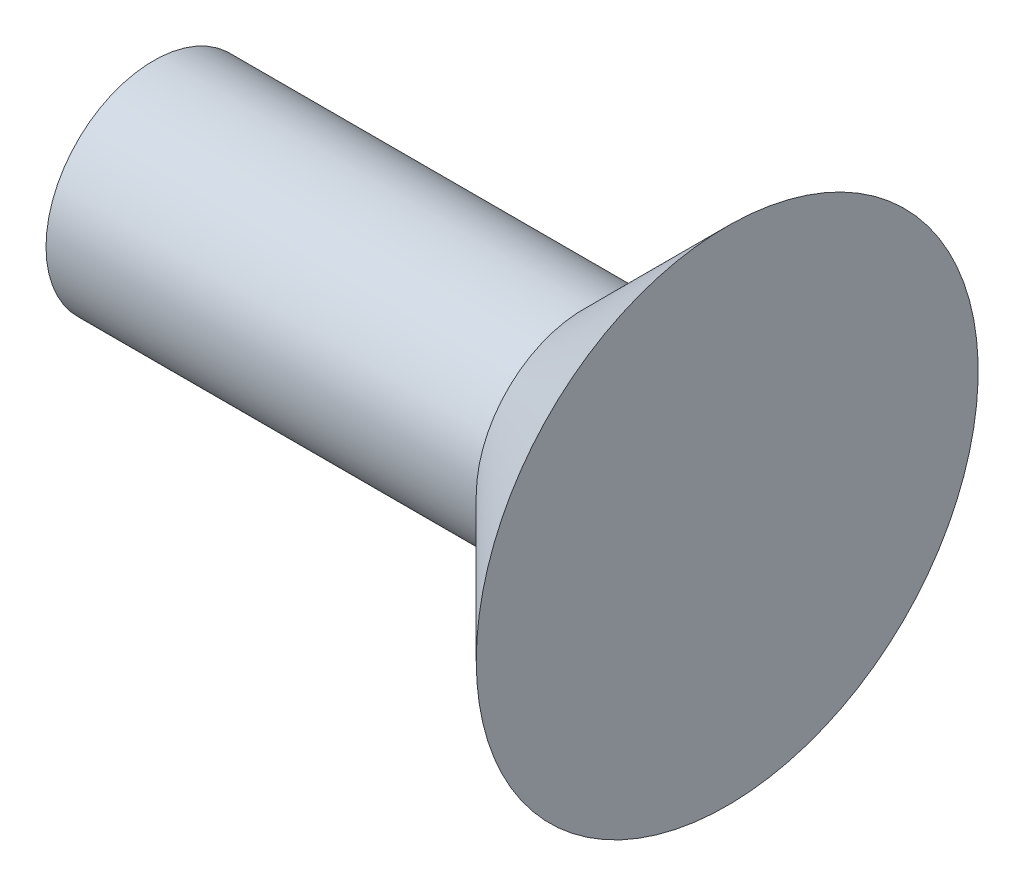
ISO-10303-21;
HEADER;
FILE_DESCRIPTION(('STEP AP214'),'2;1');
FILE_NAME('part.step','',(''),(''),'','','');
FILE_SCHEMA(('AUTOMOTIVE_DESIGN { 1 0 10303 214 1 1 1 1 }'));
ENDSEC;
DATA;
#1=APPLICATION_CONTEXT('core data for automotive mechanical design processes');
#2=APPLICATION_PROTOCOL_DEFINITION('international standard','automotive_design',2000,#1);
#3=PRODUCT_CONTEXT('',#1,'mechanical');
#4=PRODUCT('Part','Part','',(#3));
#5=PRODUCT_RELATED_PRODUCT_CATEGORY('part','',(#4));
#6=PRODUCT_DEFINITION_FORMATION('','',#4);
#7=PRODUCT_DEFINITION_CONTEXT('part definition',#1,'design');
#8=PRODUCT_DEFINITION('design','',#6,#7);
#9=PRODUCT_DEFINITION_SHAPE('','',#8);
#10=(LENGTH_UNIT() NAMED_UNIT(*) SI_UNIT(.MILLI.,.METRE.));
#11=(NAMED_UNIT(*) PLANE_ANGLE_UNIT() SI_UNIT($,.RADIAN.));
#12=(NAMED_UNIT(*) SI_UNIT($,.STERADIAN.) SOLID_ANGLE_UNIT());
#13=UNCERTAINTY_MEASURE_WITH_UNIT(LENGTH_MEASURE(1.E-05),#10,'distance_accuracy_value','');
#14=(GEOMETRIC_REPRESENTATION_CONTEXT(3) GLOBAL_UNCERTAINTY_ASSIGNED_CONTEXT((#13)) GLOBAL_UNIT_ASSIGNED_CONTEXT((#10,
#11,#12)) REPRESENTATION_CONTEXT('',''));
#15=CARTESIAN_POINT('',(0.,0.,0.));
#16=DIRECTION('',(0.,0.,1.));
#17=DIRECTION('',(1.,0.,0.));
#18=AXIS2_PLACEMENT_3D('',#15,#16,#17);
#19=CARTESIAN_POINT('',(-84.0032333856533,17.734385214472,0.));
#20=DIRECTION('',(-1.,0.,0.));
#21=DIRECTION('',(0.,0.,1.));
#22=AXIS2_PLACEMENT_3D('',#19,#20,#21);
#23=CYLINDRICAL_SURFACE('',#22,1.5);
#24=CARTESIAN_POINT('',(-78.0032333856533,17.734385214472,0.));
#25=DIRECTION('',(1.,0.,0.));
#26=DIRECTION('',(0.,0.,-1.));
#27=AXIS2_PLACEMENT_3D('',#24,#25,#26);
#28=CIRCLE('',#27,1.5);
#29=CARTESIAN_POINT('',(-78.0032333856533,17.734385214472,-1.5));
#30=VERTEX_POINT('',#29);
#31=EDGE_CURVE('E38',#30,#30,#28,.T.);
#32=ORIENTED_EDGE('',*,*,#31,.T.);
#33=EDGE_LOOP('',(#32));
#34=FACE_BOUND('',#33,.T.);
#35=CARTESIAN_POINT('',(-72.0032333856533,17.734385214472,0.));
#36=DIRECTION('',(-1.,0.,0.));
#37=DIRECTION('',(0.,0.,1.));
#38=AXIS2_PLACEMENT_3D('',#35,#36,#37);
#39=CIRCLE('',#38,1.5);
#40=CARTESIAN_POINT('',(-72.0032333856533,17.734385214472,1.5));
#41=VERTEX_POINT('',#40);
#42=EDGE_CURVE('E10',#41,#41,#39,.T.);
#43=ORIENTED_EDGE('',*,*,#42,.T.);
#44=EDGE_LOOP('',(#43));
#45=FACE_BOUND('',#44,.T.);
#46=ADVANCED_FACE('F35',(#34,#45),#23,.T.);
#47=CARTESIAN_POINT('',(-70.0032333856533,17.734385214472,0.));
#48=DIRECTION('',(1.,0.,0.));
#49=DIRECTION('',(0.,0.,-1.));
#50=AXIS2_PLACEMENT_3D('',#47,#48,#49);
#51=CONICAL_SURFACE('',#50,3.5,0.785398163397447);
#52=ORIENTED_EDGE('',*,*,#42,.F.);
#53=EDGE_LOOP('',(#52));
#54=FACE_BOUND('',#53,.T.);
#55=CARTESIAN_POINT('',(-70.0032333856533,17.734385214472,0.));
#56=DIRECTION('',(-1.,0.,0.));
#57=DIRECTION('',(0.,0.,1.));
#58=AXIS2_PLACEMENT_3D('',#55,#56,#57);
#59=CIRCLE('',#58,3.5);
#60=CARTESIAN_POINT('',(-70.0032333856533,17.734385214472,3.5));
#61=VERTEX_POINT('',#60);
#62=EDGE_CURVE('E42',#61,#61,#59,.T.);
#63=ORIENTED_EDGE('',*,*,#62,.T.);
#64=EDGE_LOOP('',(#63));
#65=FACE_BOUND('',#64,.T.);
#66=ADVANCED_FACE('F60',(#54,#65),#51,.T.);
#67=CARTESIAN_POINT('',(-70.0032333856533,17.734385214472,0.));
#68=DIRECTION('',(-1.,0.,0.));
#69=DIRECTION('',(0.,0.,1.));
#70=AXIS2_PLACEMENT_3D('',#67,#68,#69);
#71=PLANE('',#70);
#72=ORIENTED_EDGE('',*,*,#62,.F.);
#73=EDGE_LOOP('',(#72));
#74=FACE_BOUND('',#73,.T.);
#75=ADVANCED_FACE('F55',(#74),#71,.F.);
#76=CARTESIAN_POINT('',(-78.0032333856533,0.,0.));
#77=DIRECTION('',(1.,0.,0.));
#78=DIRECTION('',(0.,0.,-1.));
#79=AXIS2_PLACEMENT_3D('',#76,#77,#78);
#80=PLANE('',#79);
#81=ORIENTED_EDGE('',*,*,#31,.F.);
#82=EDGE_LOOP('',(#81));
#83=FACE_BOUND('',#82,.T.);
#84=ADVANCED_FACE('F53',(#83),#80,.F.);
#85=CLOSED_SHELL('',(#46,#66,#75,#84));
#86=MANIFOLD_SOLID_BREP('B2',#85);
#87=ADVANCED_BREP_SHAPE_REPRESENTATION('',(#18,#86),#14);
#88=SHAPE_DEFINITION_REPRESENTATION(#9,#87);
ENDSEC;
END-ISO-10303-21;
